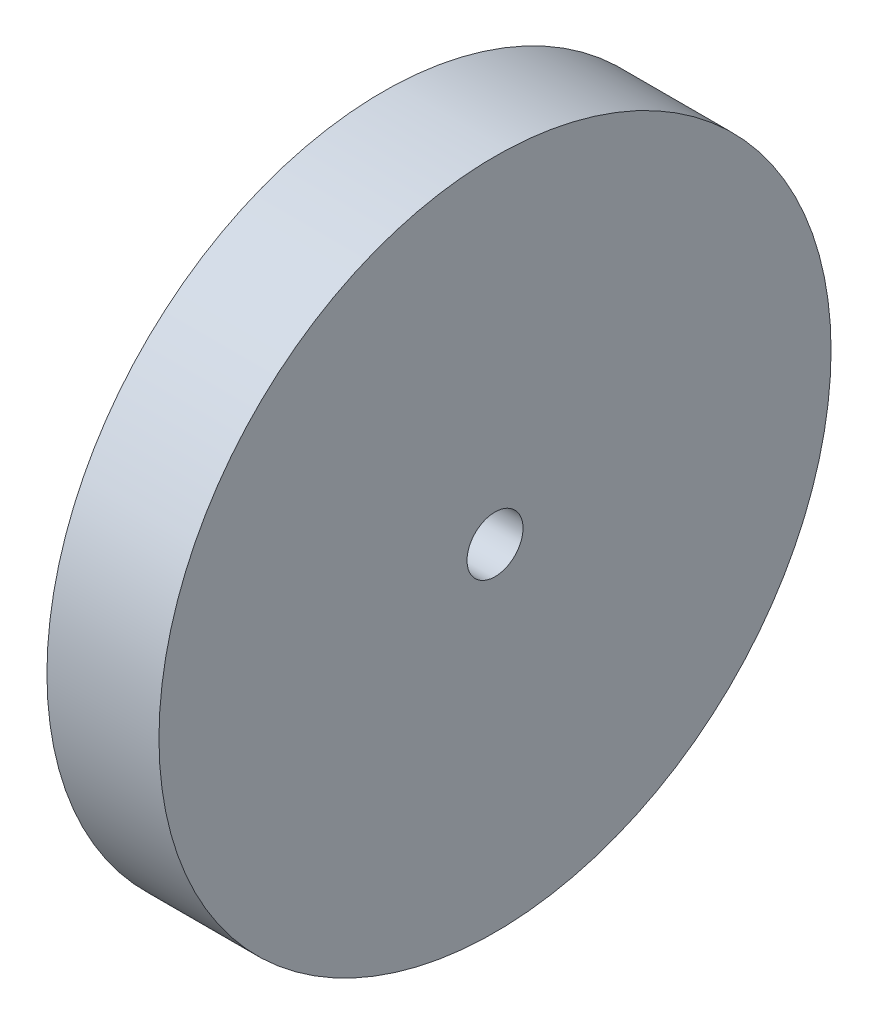
ISO-10303-21;
HEADER;
FILE_DESCRIPTION(('STEP AP214'),'2;1');
FILE_NAME('part.step','',(''),(''),'','','');
FILE_SCHEMA(('AUTOMOTIVE_DESIGN { 1 0 10303 214 1 1 1 1 }'));
ENDSEC;
DATA;
#1=APPLICATION_CONTEXT('core data for automotive mechanical design processes');
#2=APPLICATION_PROTOCOL_DEFINITION('international standard','automotive_design',2000,#1);
#3=PRODUCT_CONTEXT('',#1,'mechanical');
#4=PRODUCT('Part','Part','',(#3));
#5=PRODUCT_RELATED_PRODUCT_CATEGORY('part','',(#4));
#6=PRODUCT_DEFINITION_FORMATION('','',#4);
#7=PRODUCT_DEFINITION_CONTEXT('part definition',#1,'design');
#8=PRODUCT_DEFINITION('design','',#6,#7);
#9=PRODUCT_DEFINITION_SHAPE('','',#8);
#10=(LENGTH_UNIT() NAMED_UNIT(*) SI_UNIT(.MILLI.,.METRE.));
#11=(NAMED_UNIT(*) PLANE_ANGLE_UNIT() SI_UNIT($,.RADIAN.));
#12=(NAMED_UNIT(*) SI_UNIT($,.STERADIAN.) SOLID_ANGLE_UNIT());
#13=UNCERTAINTY_MEASURE_WITH_UNIT(LENGTH_MEASURE(1.E-05),#10,'distance_accuracy_value','');
#14=(GEOMETRIC_REPRESENTATION_CONTEXT(3) GLOBAL_UNCERTAINTY_ASSIGNED_CONTEXT((#13)) GLOBAL_UNIT_ASSIGNED_CONTEXT((#10,
#11,#12)) REPRESENTATION_CONTEXT('',''));
#15=CARTESIAN_POINT('',(0.,0.,0.));
#16=DIRECTION('',(0.,0.,1.));
#17=DIRECTION('',(1.,0.,0.));
#18=AXIS2_PLACEMENT_3D('',#15,#16,#17);
#19=CARTESIAN_POINT('',(12.7,0.,0.));
#20=DIRECTION('',(-1.,0.,0.));
#21=DIRECTION('',(0.,0.,1.));
#22=AXIS2_PLACEMENT_3D('',#19,#20,#21);
#23=CYLINDRICAL_SURFACE('',#22,38.1);
#24=CARTESIAN_POINT('',(12.7,0.,0.));
#25=DIRECTION('',(1.,0.,0.));
#26=DIRECTION('',(0.,0.,-1.));
#27=AXIS2_PLACEMENT_3D('',#24,#25,#26);
#28=CIRCLE('',#27,38.1);
#29=CARTESIAN_POINT('',(12.7,0.,-38.1));
#30=VERTEX_POINT('',#29);
#31=EDGE_CURVE('E10',#30,#30,#28,.T.);
#32=ORIENTED_EDGE('',*,*,#31,.F.);
#33=EDGE_LOOP('',(#32));
#34=FACE_BOUND('',#33,.T.);
#35=CARTESIAN_POINT('',(0.,0.,0.));
#36=DIRECTION('',(1.,0.,0.));
#37=DIRECTION('',(0.,0.,-1.));
#38=AXIS2_PLACEMENT_3D('',#35,#36,#37);
#39=CIRCLE('',#38,38.1);
#40=CARTESIAN_POINT('',(0.,0.,-38.1));
#41=VERTEX_POINT('',#40);
#42=EDGE_CURVE('E45',#41,#41,#39,.T.);
#43=ORIENTED_EDGE('',*,*,#42,.T.);
#44=EDGE_LOOP('',(#43));
#45=FACE_BOUND('',#44,.T.);
#46=ADVANCED_FACE('F42',(#34,#45),#23,.T.);
#47=CARTESIAN_POINT('',(12.7,0.,0.));
#48=DIRECTION('',(1.,0.,0.));
#49=DIRECTION('',(0.,0.,-1.));
#50=AXIS2_PLACEMENT_3D('',#47,#48,#49);
#51=PLANE('',#50);
#52=CARTESIAN_POINT('',(12.7,0.,0.));
#53=DIRECTION('',(1.,0.,0.));
#54=DIRECTION('',(0.,0.,-1.));
#55=AXIS2_PLACEMENT_3D('',#52,#53,#54);
#56=CIRCLE('',#55,3.175);
#57=CARTESIAN_POINT('',(12.7,0.,-3.175));
#58=VERTEX_POINT('',#57);
#59=EDGE_CURVE('E56',#58,#58,#56,.T.);
#60=ORIENTED_EDGE('',*,*,#59,.F.);
#61=EDGE_LOOP('',(#60));
#62=FACE_BOUND('',#61,.T.);
#63=ORIENTED_EDGE('',*,*,#31,.T.);
#64=EDGE_LOOP('',(#63));
#65=FACE_BOUND('',#64,.T.);
#66=ADVANCED_FACE('F73',(#62,#65),#51,.T.);
#67=CARTESIAN_POINT('',(0.,0.,0.));
#68=DIRECTION('',(1.,0.,0.));
#69=DIRECTION('',(0.,0.,-1.));
#70=AXIS2_PLACEMENT_3D('',#67,#68,#69);
#71=PLANE('',#70);
#72=CARTESIAN_POINT('',(0.,0.,0.));
#73=DIRECTION('',(1.,0.,0.));
#74=DIRECTION('',(0.,0.,-1.));
#75=AXIS2_PLACEMENT_3D('',#72,#73,#74);
#76=CIRCLE('',#75,3.175);
#77=CARTESIAN_POINT('',(0.,0.,-3.175));
#78=VERTEX_POINT('',#77);
#79=EDGE_CURVE('E54',#78,#78,#76,.T.);
#80=ORIENTED_EDGE('',*,*,#79,.T.);
#81=EDGE_LOOP('',(#80));
#82=FACE_BOUND('',#81,.T.);
#83=ORIENTED_EDGE('',*,*,#42,.F.);
#84=EDGE_LOOP('',(#83));
#85=FACE_BOUND('',#84,.T.);
#86=ADVANCED_FACE('F64',(#82,#85),#71,.F.);
#87=CARTESIAN_POINT('',(0.,0.,0.));
#88=DIRECTION('',(1.,0.,0.));
#89=DIRECTION('',(0.,0.,-1.));
#90=AXIS2_PLACEMENT_3D('',#87,#88,#89);
#91=CYLINDRICAL_SURFACE('',#90,3.175);
#92=ORIENTED_EDGE('',*,*,#79,.F.);
#93=EDGE_LOOP('',(#92));
#94=FACE_BOUND('',#93,.T.);
#95=ORIENTED_EDGE('',*,*,#59,.T.);
#96=EDGE_LOOP('',(#95));
#97=FACE_BOUND('',#96,.T.);
#98=ADVANCED_FACE('F67',(#94,#97),#91,.F.);
#99=CLOSED_SHELL('',(#46,#66,#86,#98));
#100=MANIFOLD_SOLID_BREP('B2',#99);
#101=ADVANCED_BREP_SHAPE_REPRESENTATION('',(#18,#100),#14);
#102=SHAPE_DEFINITION_REPRESENTATION(#9,#101);
ENDSEC;
END-ISO-10303-21;
